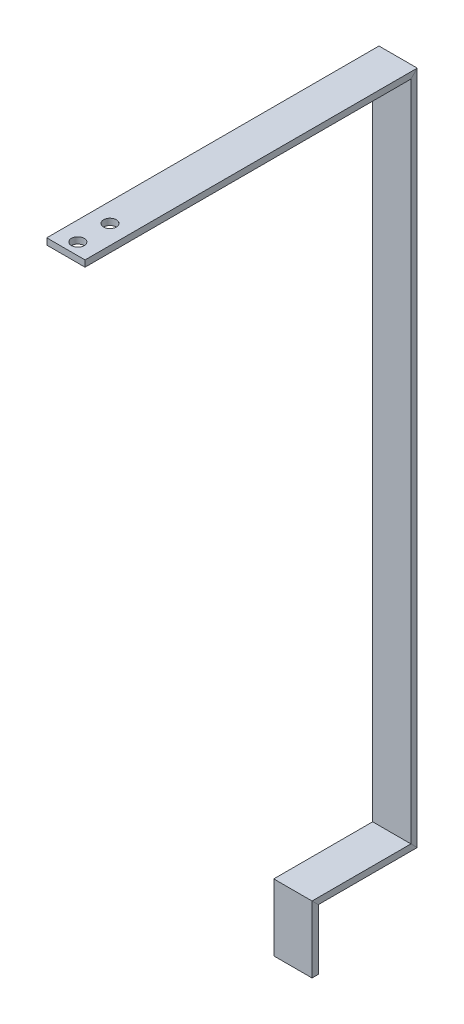
ISO-10303-21;
HEADER;
FILE_DESCRIPTION(('STEP AP214'),'2;1');
FILE_NAME('part.step','',(''),(''),'','','');
FILE_SCHEMA(('AUTOMOTIVE_DESIGN { 1 0 10303 214 1 1 1 1 }'));
ENDSEC;
DATA;
#1=APPLICATION_CONTEXT('core data for automotive mechanical design processes');
#2=APPLICATION_PROTOCOL_DEFINITION('international standard','automotive_design',2000,#1);
#3=PRODUCT_CONTEXT('',#1,'mechanical');
#4=PRODUCT('Part','Part','',(#3));
#5=PRODUCT_RELATED_PRODUCT_CATEGORY('part','',(#4));
#6=PRODUCT_DEFINITION_FORMATION('','',#4);
#7=PRODUCT_DEFINITION_CONTEXT('part definition',#1,'design');
#8=PRODUCT_DEFINITION('design','',#6,#7);
#9=PRODUCT_DEFINITION_SHAPE('','',#8);
#10=(LENGTH_UNIT() NAMED_UNIT(*) SI_UNIT(.MILLI.,.METRE.));
#11=(NAMED_UNIT(*) PLANE_ANGLE_UNIT() SI_UNIT($,.RADIAN.));
#12=(NAMED_UNIT(*) SI_UNIT($,.STERADIAN.) SOLID_ANGLE_UNIT());
#13=UNCERTAINTY_MEASURE_WITH_UNIT(LENGTH_MEASURE(1.E-05),#10,'distance_accuracy_value','');
#14=(GEOMETRIC_REPRESENTATION_CONTEXT(3) GLOBAL_UNCERTAINTY_ASSIGNED_CONTEXT((#13)) GLOBAL_UNIT_ASSIGNED_CONTEXT((#10,
#11,#12)) REPRESENTATION_CONTEXT('',''));
#15=CARTESIAN_POINT('',(0.,0.,0.));
#16=DIRECTION('',(0.,0.,1.));
#17=DIRECTION('',(1.,0.,0.));
#18=AXIS2_PLACEMENT_3D('',#15,#16,#17);
#19=CARTESIAN_POINT('',(19.05,425.25,6.31));
#20=DIRECTION('',(-1.,0.,0.));
#21=DIRECTION('',(0.,-1.,0.));
#22=AXIS2_PLACEMENT_3D('',#19,#20,#21);
#23=PLANE('',#22);
#24=DIRECTION('',(0.,1.,0.));
#25=VECTOR('',#24,1.);
#26=CARTESIAN_POINT('',(19.0499999999999,-262.476077720152,-196.49));
#27=LINE('',#26,#25);
#28=CARTESIAN_POINT('',(19.05,-275.631077720151,-196.49));
#29=VERTEX_POINT('',#28);
#30=CARTESIAN_POINT('',(19.0499999999999,383.698922279848,-196.49));
#31=VERTEX_POINT('',#30);
#32=EDGE_CURVE('E213',#29,#31,#27,.T.);
#33=ORIENTED_EDGE('',*,*,#32,.F.);
#34=DIRECTION('',(0.,-0.707106781186548,-0.707106781186548));
#35=VECTOR('',#34,1.);
#36=CARTESIAN_POINT('',(19.05,-272.208577720152,-193.0675));
#37=LINE('',#36,#35);
#38=CARTESIAN_POINT('',(19.05,-281.941077720152,-202.8));
#39=VERTEX_POINT('',#38);
#40=EDGE_CURVE('E141',#29,#39,#37,.T.);
#41=ORIENTED_EDGE('',*,*,#40,.T.);
#42=DIRECTION('',(0.,1.,0.));
#43=VECTOR('',#42,1.);
#44=CARTESIAN_POINT('',(19.0499999999999,-262.476077720152,-202.8));
#45=LINE('',#44,#43);
#46=CARTESIAN_POINT('',(19.0499999999999,390.008922279848,-202.8));
#47=VERTEX_POINT('',#46);
#48=EDGE_CURVE('E210',#39,#47,#45,.T.);
#49=ORIENTED_EDGE('',*,*,#48,.T.);
#50=DIRECTION('',(0.,-0.707106781186548,0.707106781186548));
#51=VECTOR('',#50,1.);
#52=CARTESIAN_POINT('',(19.0499999999999,60.6114222798484,126.5975));
#53=LINE('',#52,#51);
#54=EDGE_CURVE('E80',#47,#31,#53,.T.);
#55=ORIENTED_EDGE('',*,*,#54,.T.);
#56=EDGE_LOOP('',(#33,#41,#49,#55));
#57=FACE_BOUND('',#56,.T.);
#58=ADVANCED_FACE('F35',(#57),#23,.F.);
#59=CARTESIAN_POINT('',(-19.0500000000001,425.25,6.31));
#60=DIRECTION('',(1.,0.,0.));
#61=DIRECTION('',(0.,1.,0.));
#62=AXIS2_PLACEMENT_3D('',#59,#60,#61);
#63=PLANE('',#62);
#64=DIRECTION('',(0.,1.,0.));
#65=VECTOR('',#64,1.);
#66=CARTESIAN_POINT('',(-19.0499999999999,-262.476077720152,-202.8));
#67=LINE('',#66,#65);
#68=CARTESIAN_POINT('',(-19.05,-281.941077720152,-202.8));
#69=VERTEX_POINT('',#68);
#70=CARTESIAN_POINT('',(-19.0499999999999,390.008922279848,-202.8));
#71=VERTEX_POINT('',#70);
#72=EDGE_CURVE('E130',#69,#71,#67,.T.);
#73=ORIENTED_EDGE('',*,*,#72,.F.);
#74=DIRECTION('',(0.,0.707106781186548,0.707106781186548));
#75=VECTOR('',#74,1.);
#76=CARTESIAN_POINT('',(-19.05,-275.363577720152,-196.2225));
#77=LINE('',#76,#75);
#78=CARTESIAN_POINT('',(-19.0499999999999,-275.631077720151,-196.49));
#79=VERTEX_POINT('',#78);
#80=EDGE_CURVE('E149',#69,#79,#77,.T.);
#81=ORIENTED_EDGE('',*,*,#80,.T.);
#82=DIRECTION('',(0.,1.,0.));
#83=VECTOR('',#82,1.);
#84=CARTESIAN_POINT('',(-19.0499999999999,-262.476077720152,-196.49));
#85=LINE('',#84,#83);
#86=CARTESIAN_POINT('',(-19.0499999999999,383.698922279848,-196.49));
#87=VERTEX_POINT('',#86);
#88=EDGE_CURVE('E121',#79,#87,#85,.T.);
#89=ORIENTED_EDGE('',*,*,#88,.T.);
#90=DIRECTION('',(0.,0.707106781186548,-0.707106781186548));
#91=VECTOR('',#90,1.);
#92=CARTESIAN_POINT('',(-19.0499999999999,63.7664222798484,123.4425));
#93=LINE('',#92,#91);
#94=EDGE_CURVE('E44',#87,#71,#93,.T.);
#95=ORIENTED_EDGE('',*,*,#94,.T.);
#96=EDGE_LOOP('',(#73,#81,#89,#95));
#97=FACE_BOUND('',#96,.T.);
#98=ADVANCED_FACE('F153',(#97),#63,.F.);
#99=CARTESIAN_POINT('',(0.,187.208922279848,127.905));
#100=DIRECTION('',(0.,0.,1.));
#101=DIRECTION('',(0.,-1.,0.));
#102=AXIS2_PLACEMENT_3D('',#99,#100,#101);
#103=PLANE('',#102);
#104=DIRECTION('',(0.,1.,0.));
#105=VECTOR('',#104,1.);
#106=CARTESIAN_POINT('',(19.0499999999999,383.698922279848,127.905));
#107=LINE('',#106,#105);
#108=CARTESIAN_POINT('',(19.0499999999999,383.698922279848,127.905));
#109=VERTEX_POINT('',#108);
#110=CARTESIAN_POINT('',(19.0499999999999,390.008922279848,127.905));
#111=VERTEX_POINT('',#110);
#112=EDGE_CURVE('E69',#109,#111,#107,.T.);
#113=ORIENTED_EDGE('',*,*,#112,.T.);
#114=DIRECTION('',(-1.,0.,0.));
#115=VECTOR('',#114,1.);
#116=CARTESIAN_POINT('',(19.0499999999999,390.008922279848,127.905));
#117=LINE('',#116,#115);
#118=CARTESIAN_POINT('',(-19.0499999999999,390.008922279848,127.905));
#119=VERTEX_POINT('',#118);
#120=EDGE_CURVE('E220',#111,#119,#117,.T.);
#121=ORIENTED_EDGE('',*,*,#120,.T.);
#122=DIRECTION('',(0.,-1.,0.));
#123=VECTOR('',#122,1.);
#124=CARTESIAN_POINT('',(-19.0499999999999,390.008922279848,127.905));
#125=LINE('',#124,#123);
#126=CARTESIAN_POINT('',(-19.0499999999999,383.698922279848,127.905));
#127=VERTEX_POINT('',#126);
#128=EDGE_CURVE('E218',#119,#127,#125,.T.);
#129=ORIENTED_EDGE('',*,*,#128,.T.);
#130=DIRECTION('',(1.,0.,0.));
#131=VECTOR('',#130,1.);
#132=CARTESIAN_POINT('',(-19.0499999999999,383.698922279848,127.905));
#133=LINE('',#132,#131);
#134=EDGE_CURVE('E73',#127,#109,#133,.T.);
#135=ORIENTED_EDGE('',*,*,#134,.T.);
#136=EDGE_LOOP('',(#113,#121,#129,#135));
#137=FACE_BOUND('',#136,.T.);
#138=ADVANCED_FACE('F273',(#137),#103,.T.);
#139=CARTESIAN_POINT('',(19.0499999999999,383.698922279848,-203.2155));
#140=DIRECTION('',(1.,0.,0.));
#141=DIRECTION('',(0.,1.,0.));
#142=AXIS2_PLACEMENT_3D('',#139,#140,#141);
#143=PLANE('',#142);
#144=ORIENTED_EDGE('',*,*,#54,.F.);
#145=DIRECTION('',(0.,0.,1.));
#146=VECTOR('',#145,1.);
#147=CARTESIAN_POINT('',(19.0499999999999,390.008922279848,-203.2155));
#148=LINE('',#147,#146);
#149=EDGE_CURVE('E227',#47,#111,#148,.T.);
#150=ORIENTED_EDGE('',*,*,#149,.T.);
#151=ORIENTED_EDGE('',*,*,#112,.F.);
#152=DIRECTION('',(0.,0.,1.));
#153=VECTOR('',#152,1.);
#154=CARTESIAN_POINT('',(19.0499999999999,383.698922279848,-203.2155));
#155=LINE('',#154,#153);
#156=EDGE_CURVE('E38',#31,#109,#155,.T.);
#157=ORIENTED_EDGE('',*,*,#156,.F.);
#158=EDGE_LOOP('',(#144,#150,#151,#157));
#159=FACE_BOUND('',#158,.T.);
#160=ADVANCED_FACE('F232',(#159),#143,.T.);
#161=CARTESIAN_POINT('',(19.0499999999999,390.008922279848,-203.2155));
#162=DIRECTION('',(0.,1.,0.));
#163=DIRECTION('',(-1.,0.,0.));
#164=AXIS2_PLACEMENT_3D('',#161,#162,#163);
#165=PLANE('',#164);
#166=CARTESIAN_POINT('',(5.66422128936579E-12,390.008922279848,116.010000000762));
#167=DIRECTION('',(0.,1.,0.));
#168=DIRECTION('',(-1.,0.,0.));
#169=AXIS2_PLACEMENT_3D('',#166,#167,#168);
#170=CIRCLE('',#169,6.35000000000003);
#171=CARTESIAN_POINT('',(-6.34999999999436,390.008922279848,116.010000000762));
#172=VERTEX_POINT('',#171);
#173=EDGE_CURVE('E155',#172,#172,#170,.T.);
#174=ORIENTED_EDGE('',*,*,#173,.F.);
#175=EDGE_LOOP('',(#174));
#176=FACE_BOUND('',#175,.T.);
#177=CARTESIAN_POINT('',(5.55319898690327E-12,390.008922279848,84.0100000007622));
#178=DIRECTION('',(0.,1.,0.));
#179=DIRECTION('',(-1.,0.,0.));
#180=AXIS2_PLACEMENT_3D('',#177,#178,#179);
#181=CIRCLE('',#180,6.35000000000002);
#182=CARTESIAN_POINT('',(-6.34999999999447,390.008922279848,84.0100000007622));
#183=VERTEX_POINT('',#182);
#184=EDGE_CURVE('E201',#183,#183,#181,.T.);
#185=ORIENTED_EDGE('',*,*,#184,.F.);
#186=EDGE_LOOP('',(#185));
#187=FACE_BOUND('',#186,.T.);
#188=DIRECTION('',(1.,0.,0.));
#189=VECTOR('',#188,1.);
#190=CARTESIAN_POINT('',(19.05,390.008922279848,-202.8));
#191=LINE('',#190,#189);
#192=EDGE_CURVE('E11',#71,#47,#191,.T.);
#193=ORIENTED_EDGE('',*,*,#192,.F.);
#194=DIRECTION('',(0.,0.,1.));
#195=VECTOR('',#194,1.);
#196=CARTESIAN_POINT('',(-19.0499999999999,390.008922279848,-203.2155));
#197=LINE('',#196,#195);
#198=EDGE_CURVE('E226',#71,#119,#197,.T.);
#199=ORIENTED_EDGE('',*,*,#198,.T.);
#200=ORIENTED_EDGE('',*,*,#120,.F.);
#201=ORIENTED_EDGE('',*,*,#149,.F.);
#202=EDGE_LOOP('',(#193,#199,#200,#201));
#203=FACE_BOUND('',#202,.T.);
#204=ADVANCED_FACE('F293',(#176,#187,#203),#165,.T.);
#205=CARTESIAN_POINT('',(-19.0499999999999,390.008922279848,-203.2155));
#206=DIRECTION('',(-1.,0.,0.));
#207=DIRECTION('',(0.,-1.,0.));
#208=AXIS2_PLACEMENT_3D('',#205,#206,#207);
#209=PLANE('',#208);
#210=ORIENTED_EDGE('',*,*,#94,.F.);
#211=DIRECTION('',(0.,0.,1.));
#212=VECTOR('',#211,1.);
#213=CARTESIAN_POINT('',(-19.0499999999999,383.698922279848,-203.2155));
#214=LINE('',#213,#212);
#215=EDGE_CURVE('E223',#87,#127,#214,.T.);
#216=ORIENTED_EDGE('',*,*,#215,.T.);
#217=ORIENTED_EDGE('',*,*,#128,.F.);
#218=ORIENTED_EDGE('',*,*,#198,.F.);
#219=EDGE_LOOP('',(#210,#216,#217,#218));
#220=FACE_BOUND('',#219,.T.);
#221=ADVANCED_FACE('F296',(#220),#209,.T.);
#222=CARTESIAN_POINT('',(-19.0499999999999,383.698922279848,-203.2155));
#223=DIRECTION('',(0.,-1.,0.));
#224=DIRECTION('',(1.,0.,0.));
#225=AXIS2_PLACEMENT_3D('',#222,#223,#224);
#226=PLANE('',#225);
#227=CARTESIAN_POINT('',(5.66418615727626E-12,383.698922279848,116.010000000762));
#228=DIRECTION('',(0.,1.,0.));
#229=DIRECTION('',(-1.,0.,0.));
#230=AXIS2_PLACEMENT_3D('',#227,#228,#229);
#231=CIRCLE('',#230,6.35000000000003);
#232=CARTESIAN_POINT('',(-6.34999999999436,383.698922279848,116.010000000762));
#233=VERTEX_POINT('',#232);
#234=EDGE_CURVE('E159',#233,#233,#231,.T.);
#235=ORIENTED_EDGE('',*,*,#234,.T.);
#236=EDGE_LOOP('',(#235));
#237=FACE_BOUND('',#236,.T.);
#238=CARTESIAN_POINT('',(5.55316385481375E-12,383.698922279848,84.0100000007622));
#239=DIRECTION('',(0.,1.,0.));
#240=DIRECTION('',(-1.,0.,0.));
#241=AXIS2_PLACEMENT_3D('',#238,#239,#240);
#242=CIRCLE('',#241,6.35000000000002);
#243=CARTESIAN_POINT('',(-6.34999999999447,383.698922279848,84.0100000007622));
#244=VERTEX_POINT('',#243);
#245=EDGE_CURVE('E203',#244,#244,#242,.T.);
#246=ORIENTED_EDGE('',*,*,#245,.T.);
#247=EDGE_LOOP('',(#246));
#248=FACE_BOUND('',#247,.T.);
#249=DIRECTION('',(-1.,0.,0.));
#250=VECTOR('',#249,1.);
#251=CARTESIAN_POINT('',(-19.0499999999999,383.698922279848,-196.49));
#252=LINE('',#251,#250);
#253=EDGE_CURVE('E126',#31,#87,#252,.T.);
#254=ORIENTED_EDGE('',*,*,#253,.F.);
#255=ORIENTED_EDGE('',*,*,#156,.T.);
#256=ORIENTED_EDGE('',*,*,#134,.F.);
#257=ORIENTED_EDGE('',*,*,#215,.F.);
#258=EDGE_LOOP('',(#254,#255,#256,#257));
#259=FACE_BOUND('',#258,.T.);
#260=ADVANCED_FACE('F230',(#237,#248,#259),#226,.T.);
#261=CARTESIAN_POINT('',(-19.0499999999999,-262.476077720152,-196.49));
#262=DIRECTION('',(0.,0.,1.));
#263=DIRECTION('',(0.,-1.,0.));
#264=AXIS2_PLACEMENT_3D('',#261,#262,#263);
#265=PLANE('',#264);
#266=ORIENTED_EDGE('',*,*,#32,.T.);
#267=ORIENTED_EDGE('',*,*,#253,.T.);
#268=ORIENTED_EDGE('',*,*,#88,.F.);
#269=DIRECTION('',(1.,0.,0.));
#270=VECTOR('',#269,1.);
#271=CARTESIAN_POINT('',(-19.05,-275.631077720152,-196.49));
#272=LINE('',#271,#270);
#273=EDGE_CURVE('E125',#79,#29,#272,.T.);
#274=ORIENTED_EDGE('',*,*,#273,.T.);
#275=EDGE_LOOP('',(#266,#267,#268,#274));
#276=FACE_BOUND('',#275,.T.);
#277=ADVANCED_FACE('F124',(#276),#265,.T.);
#278=CARTESIAN_POINT('',(19.0499999999999,-262.476077720152,-202.8));
#279=DIRECTION('',(0.,0.,-1.));
#280=DIRECTION('',(0.,1.,0.));
#281=AXIS2_PLACEMENT_3D('',#278,#279,#280);
#282=PLANE('',#281);
#283=ORIENTED_EDGE('',*,*,#72,.T.);
#284=ORIENTED_EDGE('',*,*,#192,.T.);
#285=ORIENTED_EDGE('',*,*,#48,.F.);
#286=DIRECTION('',(-1.,0.,0.));
#287=VECTOR('',#286,1.);
#288=CARTESIAN_POINT('',(19.05,-281.941077720152,-202.8));
#289=LINE('',#288,#287);
#290=EDGE_CURVE('E156',#39,#69,#289,.T.);
#291=ORIENTED_EDGE('',*,*,#290,.T.);
#292=EDGE_LOOP('',(#283,#284,#285,#291));
#293=FACE_BOUND('',#292,.T.);
#294=ADVANCED_FACE('F237',(#293),#282,.T.);
#295=CARTESIAN_POINT('',(5.55316385481375E-12,383.698922279848,84.0100000007622));
#296=DIRECTION('',(0.,1.,0.));
#297=DIRECTION('',(-1.,0.,0.));
#298=AXIS2_PLACEMENT_3D('',#295,#296,#297);
#299=CYLINDRICAL_SURFACE('',#298,6.35000000000002);
#300=ORIENTED_EDGE('',*,*,#245,.F.);
#301=EDGE_LOOP('',(#300));
#302=FACE_BOUND('',#301,.T.);
#303=ORIENTED_EDGE('',*,*,#184,.T.);
#304=EDGE_LOOP('',(#303));
#305=FACE_BOUND('',#304,.T.);
#306=ADVANCED_FACE('F278',(#302,#305),#299,.F.);
#307=CARTESIAN_POINT('',(5.66418615727626E-12,383.698922279848,116.010000000762));
#308=DIRECTION('',(0.,1.,0.));
#309=DIRECTION('',(-1.,0.,0.));
#310=AXIS2_PLACEMENT_3D('',#307,#308,#309);
#311=CYLINDRICAL_SURFACE('',#310,6.35000000000003);
#312=ORIENTED_EDGE('',*,*,#234,.F.);
#313=EDGE_LOOP('',(#312));
#314=FACE_BOUND('',#313,.T.);
#315=ORIENTED_EDGE('',*,*,#173,.T.);
#316=EDGE_LOOP('',(#315));
#317=FACE_BOUND('',#316,.T.);
#318=ADVANCED_FACE('F285',(#314,#317),#311,.F.);
#319=CARTESIAN_POINT('',(0.,-342.026077720152,98.4300000000001));
#320=DIRECTION('',(0.,1.,0.));
#321=DIRECTION('',(0.,0.,1.));
#322=AXIS2_PLACEMENT_3D('',#319,#320,#321);
#323=PLANE('',#322);
#324=DIRECTION('',(1.,0.,0.));
#325=VECTOR('',#324,1.);
#326=CARTESIAN_POINT('',(19.05,-342.026077720152,-104.37));
#327=LINE('',#326,#325);
#328=CARTESIAN_POINT('',(-19.05,-342.026077720152,-104.37));
#329=VERTEX_POINT('',#328);
#330=CARTESIAN_POINT('',(19.05,-342.026077720152,-104.37));
#331=VERTEX_POINT('',#330);
#332=EDGE_CURVE('E183',#329,#331,#327,.T.);
#333=ORIENTED_EDGE('',*,*,#332,.T.);
#334=DIRECTION('',(0.,0.,1.));
#335=VECTOR('',#334,1.);
#336=CARTESIAN_POINT('',(19.05,-342.026077720152,-98.0599999999999));
#337=LINE('',#336,#335);
#338=CARTESIAN_POINT('',(19.05,-342.026077720152,-98.0599999999999));
#339=VERTEX_POINT('',#338);
#340=EDGE_CURVE('E181',#331,#339,#337,.T.);
#341=ORIENTED_EDGE('',*,*,#340,.T.);
#342=DIRECTION('',(-1.,0.,0.));
#343=VECTOR('',#342,1.);
#344=CARTESIAN_POINT('',(-19.05,-342.026077720152,-98.0599999999999));
#345=LINE('',#344,#343);
#346=CARTESIAN_POINT('',(-19.05,-342.026077720152,-98.0599999999999));
#347=VERTEX_POINT('',#346);
#348=EDGE_CURVE('E187',#339,#347,#345,.T.);
#349=ORIENTED_EDGE('',*,*,#348,.T.);
#350=DIRECTION('',(0.,0.,-1.));
#351=VECTOR('',#350,1.);
#352=CARTESIAN_POINT('',(-19.05,-342.026077720152,-104.37));
#353=LINE('',#352,#351);
#354=EDGE_CURVE('E185',#347,#329,#353,.T.);
#355=ORIENTED_EDGE('',*,*,#354,.T.);
#356=EDGE_LOOP('',(#333,#341,#349,#355));
#357=FACE_BOUND('',#356,.T.);
#358=ADVANCED_FACE('F254',(#357),#323,.F.);
#359=CARTESIAN_POINT('',(-19.05,-275.215577720151,-98.0599999999999));
#360=DIRECTION('',(0.,0.,1.));
#361=DIRECTION('',(1.,0.,0.));
#362=AXIS2_PLACEMENT_3D('',#359,#360,#361);
#363=PLANE('',#362);
#364=DIRECTION('',(1.,0.,0.));
#365=VECTOR('',#364,1.);
#366=CARTESIAN_POINT('',(-19.0499999999999,-275.631077720151,-98.0599999999999));
#367=LINE('',#366,#365);
#368=CARTESIAN_POINT('',(-19.05,-275.631077720151,-98.0599999999999));
#369=VERTEX_POINT('',#368);
#370=CARTESIAN_POINT('',(19.05,-275.631077720151,-98.0599999999999));
#371=VERTEX_POINT('',#370);
#372=EDGE_CURVE('E173',#369,#371,#367,.T.);
#373=ORIENTED_EDGE('',*,*,#372,.F.);
#374=DIRECTION('',(0.,-1.,0.));
#375=VECTOR('',#374,1.);
#376=CARTESIAN_POINT('',(-19.05,-275.215577720151,-98.0599999999999));
#377=LINE('',#376,#375);
#378=EDGE_CURVE('E195',#369,#347,#377,.T.);
#379=ORIENTED_EDGE('',*,*,#378,.T.);
#380=ORIENTED_EDGE('',*,*,#348,.F.);
#381=DIRECTION('',(0.,-1.,0.));
#382=VECTOR('',#381,1.);
#383=CARTESIAN_POINT('',(19.05,-275.215577720151,-98.0599999999999));
#384=LINE('',#383,#382);
#385=EDGE_CURVE('E177',#371,#339,#384,.T.);
#386=ORIENTED_EDGE('',*,*,#385,.F.);
#387=EDGE_LOOP('',(#373,#379,#380,#386));
#388=FACE_BOUND('',#387,.T.);
#389=ADVANCED_FACE('F250',(#388),#363,.T.);
#390=CARTESIAN_POINT('',(-19.05,-275.215577720151,-104.37));
#391=DIRECTION('',(-1.,0.,0.));
#392=DIRECTION('',(0.,0.,1.));
#393=AXIS2_PLACEMENT_3D('',#390,#391,#392);
#394=PLANE('',#393);
#395=DIRECTION('',(0.,0.707106781186548,0.707106781186548));
#396=VECTOR('',#395,1.);
#397=CARTESIAN_POINT('',(-19.0500000000003,-331.363827720152,-153.79275));
#398=LINE('',#397,#396);
#399=CARTESIAN_POINT('',(-19.05,-281.941077720152,-104.37));
#400=VERTEX_POINT('',#399);
#401=EDGE_CURVE('E142',#400,#369,#398,.T.);
#402=ORIENTED_EDGE('',*,*,#401,.F.);
#403=DIRECTION('',(0.,-1.,0.));
#404=VECTOR('',#403,1.);
#405=CARTESIAN_POINT('',(-19.05,-275.215577720151,-104.37));
#406=LINE('',#405,#404);
#407=EDGE_CURVE('E192',#400,#329,#406,.T.);
#408=ORIENTED_EDGE('',*,*,#407,.T.);
#409=ORIENTED_EDGE('',*,*,#354,.F.);
#410=ORIENTED_EDGE('',*,*,#378,.F.);
#411=EDGE_LOOP('',(#402,#408,#409,#410));
#412=FACE_BOUND('',#411,.T.);
#413=ADVANCED_FACE('F257',(#412),#394,.T.);
#414=CARTESIAN_POINT('',(19.05,-275.215577720151,-104.37));
#415=DIRECTION('',(0.,0.,-1.));
#416=DIRECTION('',(-1.,0.,0.));
#417=AXIS2_PLACEMENT_3D('',#414,#415,#416);
#418=PLANE('',#417);
#419=DIRECTION('',(-1.,0.,0.));
#420=VECTOR('',#419,1.);
#421=CARTESIAN_POINT('',(19.0500000000001,-281.941077720152,-104.37));
#422=LINE('',#421,#420);
#423=CARTESIAN_POINT('',(19.05,-281.941077720152,-104.37));
#424=VERTEX_POINT('',#423);
#425=EDGE_CURVE('E167',#424,#400,#422,.T.);
#426=ORIENTED_EDGE('',*,*,#425,.F.);
#427=DIRECTION('',(0.,-1.,0.));
#428=VECTOR('',#427,1.);
#429=CARTESIAN_POINT('',(19.05,-275.215577720151,-104.37));
#430=LINE('',#429,#428);
#431=EDGE_CURVE('E189',#424,#331,#430,.T.);
#432=ORIENTED_EDGE('',*,*,#431,.T.);
#433=ORIENTED_EDGE('',*,*,#332,.F.);
#434=ORIENTED_EDGE('',*,*,#407,.F.);
#435=EDGE_LOOP('',(#426,#432,#433,#434));
#436=FACE_BOUND('',#435,.T.);
#437=ADVANCED_FACE('F260',(#436),#418,.T.);
#438=CARTESIAN_POINT('',(19.05,-275.215577720151,-98.0599999999999));
#439=DIRECTION('',(1.,0.,0.));
#440=DIRECTION('',(0.,0.,-1.));
#441=AXIS2_PLACEMENT_3D('',#438,#439,#440);
#442=PLANE('',#441);
#443=DIRECTION('',(0.,-0.707106781186548,-0.707106781186548));
#444=VECTOR('',#443,1.);
#445=CARTESIAN_POINT('',(19.05,-328.208827720152,-150.63775));
#446=LINE('',#445,#444);
#447=EDGE_CURVE('E170',#371,#424,#446,.T.);
#448=ORIENTED_EDGE('',*,*,#447,.F.);
#449=ORIENTED_EDGE('',*,*,#385,.T.);
#450=ORIENTED_EDGE('',*,*,#340,.F.);
#451=ORIENTED_EDGE('',*,*,#431,.F.);
#452=EDGE_LOOP('',(#448,#449,#450,#451));
#453=FACE_BOUND('',#452,.T.);
#454=ADVANCED_FACE('F246',(#453),#442,.T.);
#455=CARTESIAN_POINT('',(19.05,-275.631077720151,-203.2155));
#456=DIRECTION('',(1.,0.,0.));
#457=DIRECTION('',(0.,1.,0.));
#458=AXIS2_PLACEMENT_3D('',#455,#456,#457);
#459=PLANE('',#458);
#460=DIRECTION('',(0.,0.,1.));
#461=VECTOR('',#460,1.);
#462=CARTESIAN_POINT('',(19.05,-275.631077720151,-203.2155));
#463=LINE('',#462,#461);
#464=EDGE_CURVE('E140',#29,#371,#463,.T.);
#465=ORIENTED_EDGE('',*,*,#464,.T.);
#466=ORIENTED_EDGE('',*,*,#447,.T.);
#467=DIRECTION('',(0.,0.,1.));
#468=VECTOR('',#467,1.);
#469=CARTESIAN_POINT('',(19.05,-281.941077720152,-203.2155));
#470=LINE('',#469,#468);
#471=EDGE_CURVE('E174',#39,#424,#470,.T.);
#472=ORIENTED_EDGE('',*,*,#471,.F.);
#473=ORIENTED_EDGE('',*,*,#40,.F.);
#474=EDGE_LOOP('',(#465,#466,#472,#473));
#475=FACE_BOUND('',#474,.T.);
#476=ADVANCED_FACE('F242',(#475),#459,.T.);
#477=CARTESIAN_POINT('',(19.05,-281.941077720152,-203.2155));
#478=DIRECTION('',(0.,-1.,0.));
#479=DIRECTION('',(1.,0.,0.));
#480=AXIS2_PLACEMENT_3D('',#477,#478,#479);
#481=PLANE('',#480);
#482=ORIENTED_EDGE('',*,*,#471,.T.);
#483=ORIENTED_EDGE('',*,*,#425,.T.);
#484=DIRECTION('',(0.,0.,1.));
#485=VECTOR('',#484,1.);
#486=CARTESIAN_POINT('',(-19.05,-281.941077720152,-203.2155));
#487=LINE('',#486,#485);
#488=EDGE_CURVE('E151',#69,#400,#487,.T.);
#489=ORIENTED_EDGE('',*,*,#488,.F.);
#490=ORIENTED_EDGE('',*,*,#290,.F.);
#491=EDGE_LOOP('',(#482,#483,#489,#490));
#492=FACE_BOUND('',#491,.T.);
#493=ADVANCED_FACE('F240',(#492),#481,.T.);
#494=CARTESIAN_POINT('',(-19.05,-281.941077720152,-203.2155));
#495=DIRECTION('',(-1.,0.,0.));
#496=DIRECTION('',(0.,-1.,0.));
#497=AXIS2_PLACEMENT_3D('',#494,#495,#496);
#498=PLANE('',#497);
#499=ORIENTED_EDGE('',*,*,#488,.T.);
#500=ORIENTED_EDGE('',*,*,#401,.T.);
#501=DIRECTION('',(0.,0.,1.));
#502=VECTOR('',#501,1.);
#503=CARTESIAN_POINT('',(-19.0499999999999,-275.631077720151,-203.2155));
#504=LINE('',#503,#502);
#505=EDGE_CURVE('E138',#79,#369,#504,.T.);
#506=ORIENTED_EDGE('',*,*,#505,.F.);
#507=ORIENTED_EDGE('',*,*,#80,.F.);
#508=EDGE_LOOP('',(#499,#500,#506,#507));
#509=FACE_BOUND('',#508,.T.);
#510=ADVANCED_FACE('F148',(#509),#498,.T.);
#511=CARTESIAN_POINT('',(-19.0499999999999,-275.631077720151,-203.2155));
#512=DIRECTION('',(0.,1.,0.));
#513=DIRECTION('',(-1.,0.,0.));
#514=AXIS2_PLACEMENT_3D('',#511,#512,#513);
#515=PLANE('',#514);
#516=ORIENTED_EDGE('',*,*,#505,.T.);
#517=ORIENTED_EDGE('',*,*,#372,.T.);
#518=ORIENTED_EDGE('',*,*,#464,.F.);
#519=ORIENTED_EDGE('',*,*,#273,.F.);
#520=EDGE_LOOP('',(#516,#517,#518,#519));
#521=FACE_BOUND('',#520,.T.);
#522=ADVANCED_FACE('F136',(#521),#515,.T.);
#523=CLOSED_SHELL('',(#58,#98,#138,#160,#204,#221,#260,#277,#294,#306,#318,#358,#389,#413,#437,
#454,#476,#493,#510,#522));
#524=MANIFOLD_SOLID_BREP('B2',#523);
#525=ADVANCED_BREP_SHAPE_REPRESENTATION('',(#18,#524),#14);
#526=SHAPE_DEFINITION_REPRESENTATION(#9,#525);
ENDSEC;
END-ISO-10303-21;
